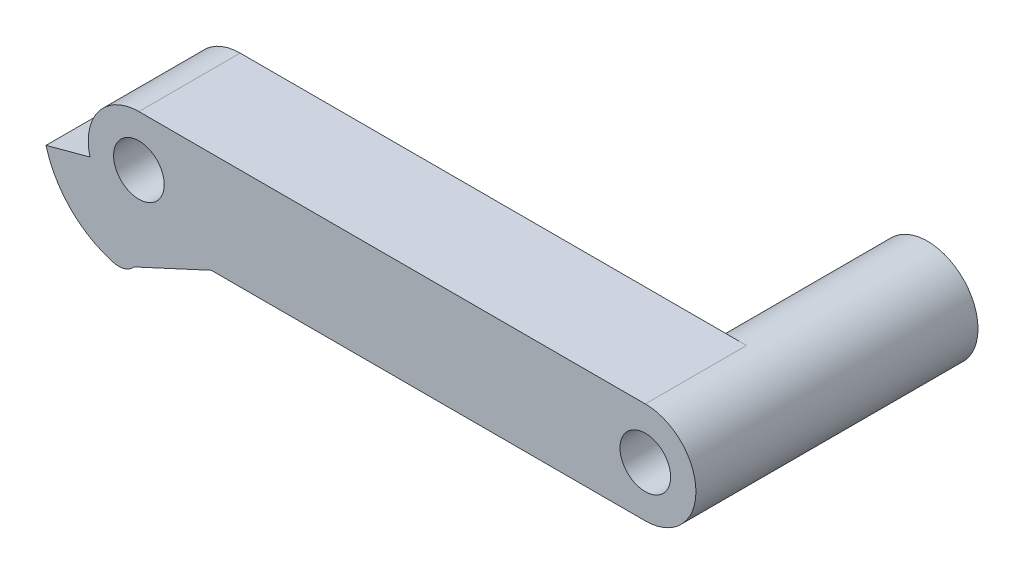
ISO-10303-21;
HEADER;
FILE_DESCRIPTION(('STEP AP214'),'2;1');
FILE_NAME('part.step','',(''),(''),'','','');
FILE_SCHEMA(('AUTOMOTIVE_DESIGN { 1 0 10303 214 1 1 1 1 }'));
ENDSEC;
DATA;
#1=APPLICATION_CONTEXT('core data for automotive mechanical design processes');
#2=APPLICATION_PROTOCOL_DEFINITION('international standard','automotive_design',2000,#1);
#3=PRODUCT_CONTEXT('',#1,'mechanical');
#4=PRODUCT('Part','Part','',(#3));
#5=PRODUCT_RELATED_PRODUCT_CATEGORY('part','',(#4));
#6=PRODUCT_DEFINITION_FORMATION('','',#4);
#7=PRODUCT_DEFINITION_CONTEXT('part definition',#1,'design');
#8=PRODUCT_DEFINITION('design','',#6,#7);
#9=PRODUCT_DEFINITION_SHAPE('','',#8);
#10=(LENGTH_UNIT() NAMED_UNIT(*) SI_UNIT(.MILLI.,.METRE.));
#11=(NAMED_UNIT(*) PLANE_ANGLE_UNIT() SI_UNIT($,.RADIAN.));
#12=(NAMED_UNIT(*) SI_UNIT($,.STERADIAN.) SOLID_ANGLE_UNIT());
#13=UNCERTAINTY_MEASURE_WITH_UNIT(LENGTH_MEASURE(1.E-05),#10,'distance_accuracy_value','');
#14=(GEOMETRIC_REPRESENTATION_CONTEXT(3) GLOBAL_UNCERTAINTY_ASSIGNED_CONTEXT((#13)) GLOBAL_UNIT_ASSIGNED_CONTEXT((#10,
#11,#12)) REPRESENTATION_CONTEXT('',''));
#15=CARTESIAN_POINT('',(0.,0.,0.));
#16=DIRECTION('',(0.,0.,1.));
#17=DIRECTION('',(1.,0.,0.));
#18=AXIS2_PLACEMENT_3D('',#15,#16,#17);
#19=CARTESIAN_POINT('',(0.,0.,-12.3012954674884));
#20=DIRECTION('',(0.,0.,1.));
#21=DIRECTION('',(1.,0.,0.));
#22=AXIS2_PLACEMENT_3D('',#19,#20,#21);
#23=CYLINDRICAL_SURFACE('',#22,9.5);
#24=CARTESIAN_POINT('',(0.,0.,10.));
#25=DIRECTION('',(0.,0.,1.));
#26=DIRECTION('',(1.,0.,0.));
#27=AXIS2_PLACEMENT_3D('',#24,#25,#26);
#28=CIRCLE('',#27,9.5);
#29=CARTESIAN_POINT('',(-9.17194693313327,-2.47495241485308,10.));
#30=VERTEX_POINT('',#29);
#31=CARTESIAN_POINT('',(-2.53333333333323,-9.1559937867073,10.));
#32=VERTEX_POINT('',#31);
#33=EDGE_CURVE('E117',#30,#32,#28,.T.);
#34=ORIENTED_EDGE('',*,*,#33,.F.);
#35=DIRECTION('',(0.,0.,1.));
#36=VECTOR('',#35,1.);
#37=CARTESIAN_POINT('',(-9.17194693313327,-2.47495241485308,-12.3012954674884));
#38=LINE('',#37,#36);
#39=CARTESIAN_POINT('',(-9.17194693313327,-2.47495241485308,0.));
#40=VERTEX_POINT('',#39);
#41=EDGE_CURVE('E102',#40,#30,#38,.T.);
#42=ORIENTED_EDGE('',*,*,#41,.F.);
#43=CARTESIAN_POINT('',(0.,0.,0.));
#44=DIRECTION('',(0.,0.,1.));
#45=DIRECTION('',(1.,0.,0.));
#46=AXIS2_PLACEMENT_3D('',#43,#44,#45);
#47=CIRCLE('',#46,9.5);
#48=CARTESIAN_POINT('',(-2.53333333333323,-9.1559937867073,0.));
#49=VERTEX_POINT('',#48);
#50=EDGE_CURVE('E112',#49,#40,#47,.F.);
#51=ORIENTED_EDGE('',*,*,#50,.F.);
#52=DIRECTION('',(0.,0.,1.));
#53=VECTOR('',#52,1.);
#54=CARTESIAN_POINT('',(-2.53333333333324,-9.1559937867073,-12.3012954674884));
#55=LINE('',#54,#53);
#56=EDGE_CURVE('E119',#49,#32,#55,.T.);
#57=ORIENTED_EDGE('',*,*,#56,.T.);
#58=EDGE_LOOP('',(#34,#42,#51,#57));
#59=FACE_BOUND('',#58,.T.);
#60=ADVANCED_FACE('F38',(#59),#23,.T.);
#61=CARTESIAN_POINT('',(0.,-5.,10.));
#62=DIRECTION('',(0.,1.,0.));
#63=DIRECTION('',(-1.,0.,0.));
#64=AXIS2_PLACEMENT_3D('',#61,#62,#63);
#65=PLANE('',#64);
#66=DIRECTION('',(1.,0.,0.));
#67=VECTOR('',#66,1.);
#68=CARTESIAN_POINT('',(0.,-5.,10.));
#69=LINE('',#68,#67);
#70=CARTESIAN_POINT('',(7.14343941971596,-5.,10.));
#71=VERTEX_POINT('',#70);
#72=CARTESIAN_POINT('',(50.,-5.,10.));
#73=VERTEX_POINT('',#72);
#74=EDGE_CURVE('E148',#71,#73,#69,.T.);
#75=ORIENTED_EDGE('',*,*,#74,.F.);
#76=DIRECTION('',(0.,0.,-1.));
#77=VECTOR('',#76,1.);
#78=CARTESIAN_POINT('',(7.14343941971596,-5.,10.));
#79=LINE('',#78,#77);
#80=CARTESIAN_POINT('',(7.14343941971596,-5.,0.));
#81=VERTEX_POINT('',#80);
#82=EDGE_CURVE('E178',#71,#81,#79,.T.);
#83=ORIENTED_EDGE('',*,*,#82,.T.);
#84=DIRECTION('',(1.,0.,0.));
#85=VECTOR('',#84,1.);
#86=CARTESIAN_POINT('',(0.,-5.,0.));
#87=LINE('',#86,#85);
#88=CARTESIAN_POINT('',(50.,-5.,0.));
#89=VERTEX_POINT('',#88);
#90=EDGE_CURVE('E145',#81,#89,#87,.T.);
#91=ORIENTED_EDGE('',*,*,#90,.T.);
#92=DIRECTION('',(0.,0.,-1.));
#93=VECTOR('',#92,1.);
#94=CARTESIAN_POINT('',(50.,-5.,10.));
#95=LINE('',#94,#93);
#96=EDGE_CURVE('E167',#73,#89,#95,.T.);
#97=ORIENTED_EDGE('',*,*,#96,.F.);
#98=EDGE_LOOP('',(#75,#83,#91,#97));
#99=FACE_BOUND('',#98,.T.);
#100=ADVANCED_FACE('F184',(#99),#65,.F.);
#101=CARTESIAN_POINT('',(50.,0.,10.));
#102=DIRECTION('',(0.,0.,-1.));
#103=DIRECTION('',(-1.,0.,0.));
#104=AXIS2_PLACEMENT_3D('',#101,#102,#103);
#105=CYLINDRICAL_SURFACE('',#104,5.);
#106=ORIENTED_EDGE('',*,*,#96,.T.);
#107=CARTESIAN_POINT('',(50.,0.,0.));
#108=DIRECTION('',(0.,0.,1.));
#109=DIRECTION('',(1.,0.,0.));
#110=AXIS2_PLACEMENT_3D('',#107,#108,#109);
#111=CIRCLE('',#110,5.);
#112=CARTESIAN_POINT('',(50.,5.,0.));
#113=VERTEX_POINT('',#112);
#114=EDGE_CURVE('E170',#113,#89,#111,.T.);
#115=ORIENTED_EDGE('',*,*,#114,.F.);
#116=DIRECTION('',(0.,0.,-1.));
#117=VECTOR('',#116,1.);
#118=CARTESIAN_POINT('',(50.,5.,10.));
#119=LINE('',#118,#117);
#120=CARTESIAN_POINT('',(50.,5.,10.));
#121=VERTEX_POINT('',#120);
#122=EDGE_CURVE('E164',#121,#113,#119,.T.);
#123=ORIENTED_EDGE('',*,*,#122,.F.);
#124=CARTESIAN_POINT('',(50.,0.,10.));
#125=DIRECTION('',(0.,0.,1.));
#126=DIRECTION('',(1.,0.,0.));
#127=AXIS2_PLACEMENT_3D('',#124,#125,#126);
#128=CIRCLE('',#127,5.);
#129=EDGE_CURVE('E150',#73,#121,#128,.T.);
#130=ORIENTED_EDGE('',*,*,#129,.F.);
#131=EDGE_LOOP('',(#106,#115,#123,#130));
#132=FACE_BOUND('',#131,.T.);
#133=CARTESIAN_POINT('',(50.,0.,-17.85));
#134=DIRECTION('',(0.,0.,1.));
#135=DIRECTION('',(1.,0.,0.));
#136=AXIS2_PLACEMENT_3D('',#133,#134,#135);
#137=CIRCLE('',#136,5.);
#138=CARTESIAN_POINT('',(55.,0.,-17.85));
#139=VERTEX_POINT('',#138);
#140=EDGE_CURVE('E138',#139,#139,#137,.T.);
#141=ORIENTED_EDGE('',*,*,#140,.T.);
#142=EDGE_LOOP('',(#141));
#143=FACE_BOUND('',#142,.T.);
#144=ADVANCED_FACE('F194',(#132,#143),#105,.T.);
#145=CARTESIAN_POINT('',(0.,5.,10.));
#146=DIRECTION('',(0.,1.,0.));
#147=DIRECTION('',(-1.,0.,0.));
#148=AXIS2_PLACEMENT_3D('',#145,#146,#147);
#149=PLANE('',#148);
#150=DIRECTION('',(1.,0.,0.));
#151=VECTOR('',#150,1.);
#152=CARTESIAN_POINT('',(0.,5.,0.));
#153=LINE('',#152,#151);
#154=CARTESIAN_POINT('',(0.,5.,0.));
#155=VERTEX_POINT('',#154);
#156=EDGE_CURVE('E159',#155,#113,#153,.T.);
#157=ORIENTED_EDGE('',*,*,#156,.F.);
#158=DIRECTION('',(0.,0.,-1.));
#159=VECTOR('',#158,1.);
#160=CARTESIAN_POINT('',(0.,5.,10.));
#161=LINE('',#160,#159);
#162=CARTESIAN_POINT('',(0.,5.,10.));
#163=VERTEX_POINT('',#162);
#164=EDGE_CURVE('E157',#163,#155,#161,.T.);
#165=ORIENTED_EDGE('',*,*,#164,.F.);
#166=DIRECTION('',(1.,0.,0.));
#167=VECTOR('',#166,1.);
#168=CARTESIAN_POINT('',(0.,5.,10.));
#169=LINE('',#168,#167);
#170=EDGE_CURVE('E153',#163,#121,#169,.T.);
#171=ORIENTED_EDGE('',*,*,#170,.T.);
#172=ORIENTED_EDGE('',*,*,#122,.T.);
#173=EDGE_LOOP('',(#157,#165,#171,#172));
#174=FACE_BOUND('',#173,.T.);
#175=ADVANCED_FACE('F233',(#174),#149,.T.);
#176=CARTESIAN_POINT('',(0.,0.,10.));
#177=DIRECTION('',(0.,0.,-1.));
#178=DIRECTION('',(-1.,0.,0.));
#179=AXIS2_PLACEMENT_3D('',#176,#177,#178);
#180=CYLINDRICAL_SURFACE('',#179,5.);
#181=DIRECTION('',(0.,0.,1.));
#182=VECTOR('',#181,1.);
#183=CARTESIAN_POINT('',(-4.82734049112278,-1.3026065341332,-12.3012954674884));
#184=LINE('',#183,#182);
#185=CARTESIAN_POINT('',(-4.82734049112278,-1.3026065341332,0.));
#186=VERTEX_POINT('',#185);
#187=CARTESIAN_POINT('',(-4.82734049112278,-1.3026065341332,10.));
#188=VERTEX_POINT('',#187);
#189=EDGE_CURVE('E113',#186,#188,#184,.T.);
#190=ORIENTED_EDGE('',*,*,#189,.T.);
#191=CARTESIAN_POINT('',(0.,0.,10.));
#192=DIRECTION('',(0.,0.,1.));
#193=DIRECTION('',(1.,0.,0.));
#194=AXIS2_PLACEMENT_3D('',#191,#192,#193);
#195=CIRCLE('',#194,5.);
#196=EDGE_CURVE('E127',#163,#188,#195,.T.);
#197=ORIENTED_EDGE('',*,*,#196,.F.);
#198=ORIENTED_EDGE('',*,*,#164,.T.);
#199=CARTESIAN_POINT('',(0.,0.,0.));
#200=DIRECTION('',(0.,0.,1.));
#201=DIRECTION('',(1.,0.,0.));
#202=AXIS2_PLACEMENT_3D('',#199,#200,#201);
#203=CIRCLE('',#202,5.);
#204=EDGE_CURVE('E151',#155,#186,#203,.T.);
#205=ORIENTED_EDGE('',*,*,#204,.T.);
#206=EDGE_LOOP('',(#190,#197,#198,#205));
#207=FACE_BOUND('',#206,.T.);
#208=ADVANCED_FACE('F226',(#207),#180,.T.);
#209=CARTESIAN_POINT('',(0.,0.,10.));
#210=DIRECTION('',(0.,0.,1.));
#211=DIRECTION('',(1.,0.,0.));
#212=AXIS2_PLACEMENT_3D('',#209,#210,#211);
#213=PLANE('',#212);
#214=CARTESIAN_POINT('',(50.,0.,10.));
#215=DIRECTION('',(0.,0.,-1.));
#216=DIRECTION('',(-1.,0.,0.));
#217=AXIS2_PLACEMENT_3D('',#214,#215,#216);
#218=CIRCLE('',#217,2.5);
#219=CARTESIAN_POINT('',(47.5,0.,10.));
#220=VERTEX_POINT('',#219);
#221=EDGE_CURVE('E404',#220,#220,#218,.T.);
#222=ORIENTED_EDGE('',*,*,#221,.T.);
#223=EDGE_LOOP('',(#222));
#224=FACE_BOUND('',#223,.T.);
#225=ORIENTED_EDGE('',*,*,#33,.T.);
#226=CARTESIAN_POINT('',(-1.99999999999992,-7.2284161474005,10.));
#227=DIRECTION('',(0.,0.,1.));
#228=DIRECTION('',(1.,0.,0.));
#229=AXIS2_PLACEMENT_3D('',#226,#227,#228);
#230=CIRCLE('',#229,2.);
#231=CARTESIAN_POINT('',(-0.476093430047268,-8.52368012283375,10.));
#232=VERTEX_POINT('',#231);
#233=EDGE_CURVE('E174',#32,#232,#230,.T.);
#234=ORIENTED_EDGE('',*,*,#233,.T.);
#235=DIRECTION('',(-0.907643098281649,-0.419742785693439,0.));
#236=VECTOR('',#235,1.);
#237=CARTESIAN_POINT('',(7.14343941971596,-5.,10.));
#238=LINE('',#237,#236);
#239=EDGE_CURVE('E12',#232,#71,#238,.F.);
#240=ORIENTED_EDGE('',*,*,#239,.T.);
#241=ORIENTED_EDGE('',*,*,#74,.T.);
#242=ORIENTED_EDGE('',*,*,#129,.T.);
#243=ORIENTED_EDGE('',*,*,#170,.F.);
#244=ORIENTED_EDGE('',*,*,#196,.T.);
#245=DIRECTION('',(-0.965468098224555,-0.260521306826641,0.));
#246=VECTOR('',#245,1.);
#247=CARTESIAN_POINT('',(-9.17194693313327,-2.47495241485309,10.));
#248=LINE('',#247,#246);
#249=EDGE_CURVE('E107',#188,#30,#248,.T.);
#250=ORIENTED_EDGE('',*,*,#249,.T.);
#251=EDGE_LOOP('',(#225,#234,#240,#241,#242,#243,#244,#250));
#252=FACE_BOUND('',#251,.T.);
#253=CARTESIAN_POINT('',(0.,0.,10.));
#254=DIRECTION('',(0.,0.,1.));
#255=DIRECTION('',(1.,0.,0.));
#256=AXIS2_PLACEMENT_3D('',#253,#254,#255);
#257=CIRCLE('',#256,2.5);
#258=CARTESIAN_POINT('',(2.5,0.,10.));
#259=VERTEX_POINT('',#258);
#260=EDGE_CURVE('E141',#259,#259,#257,.T.);
#261=ORIENTED_EDGE('',*,*,#260,.F.);
#262=EDGE_LOOP('',(#261));
#263=FACE_BOUND('',#262,.T.);
#264=ADVANCED_FACE('F123',(#224,#252,#263),#213,.T.);
#265=CARTESIAN_POINT('',(0.,0.,0.));
#266=DIRECTION('',(0.,0.,1.));
#267=DIRECTION('',(1.,0.,0.));
#268=AXIS2_PLACEMENT_3D('',#265,#266,#267);
#269=PLANE('',#268);
#270=CARTESIAN_POINT('',(0.,0.,0.));
#271=DIRECTION('',(0.,0.,1.));
#272=DIRECTION('',(1.,0.,0.));
#273=AXIS2_PLACEMENT_3D('',#270,#271,#272);
#274=CIRCLE('',#273,2.5);
#275=CARTESIAN_POINT('',(2.5,0.,0.));
#276=VERTEX_POINT('',#275);
#277=EDGE_CURVE('E142',#276,#276,#274,.T.);
#278=ORIENTED_EDGE('',*,*,#277,.T.);
#279=EDGE_LOOP('',(#278));
#280=FACE_BOUND('',#279,.T.);
#281=ORIENTED_EDGE('',*,*,#90,.F.);
#282=DIRECTION('',(0.907643098281649,0.419742785693439,0.));
#283=VECTOR('',#282,1.);
#284=CARTESIAN_POINT('',(3.16344298703683,-6.84056353523254,0.));
#285=LINE('',#284,#283);
#286=CARTESIAN_POINT('',(-0.476093430047268,-8.52368012283375,0.));
#287=VERTEX_POINT('',#286);
#288=EDGE_CURVE('E46',#81,#287,#285,.F.);
#289=ORIENTED_EDGE('',*,*,#288,.T.);
#290=CARTESIAN_POINT('',(-1.99999999999992,-7.2284161474005,0.));
#291=DIRECTION('',(0.,0.,1.));
#292=DIRECTION('',(1.,0.,0.));
#293=AXIS2_PLACEMENT_3D('',#290,#291,#292);
#294=CIRCLE('',#293,2.);
#295=EDGE_CURVE('E176',#287,#49,#294,.F.);
#296=ORIENTED_EDGE('',*,*,#295,.T.);
#297=ORIENTED_EDGE('',*,*,#50,.T.);
#298=DIRECTION('',(0.965468098224555,0.260521306826641,0.));
#299=VECTOR('',#298,1.);
#300=CARTESIAN_POINT('',(-9.17194693313327,-2.47495241485309,0.));
#301=LINE('',#300,#299);
#302=EDGE_CURVE('E109',#40,#186,#301,.T.);
#303=ORIENTED_EDGE('',*,*,#302,.T.);
#304=ORIENTED_EDGE('',*,*,#204,.F.);
#305=ORIENTED_EDGE('',*,*,#156,.T.);
#306=ORIENTED_EDGE('',*,*,#114,.T.);
#307=EDGE_LOOP('',(#281,#289,#296,#297,#303,#304,#305,#306));
#308=FACE_BOUND('',#307,.T.);
#309=ADVANCED_FACE('F188',(#280,#308),#269,.F.);
#310=CARTESIAN_POINT('',(0.,0.,0.));
#311=DIRECTION('',(0.,0.,1.));
#312=DIRECTION('',(1.,0.,0.));
#313=AXIS2_PLACEMENT_3D('',#310,#311,#312);
#314=CYLINDRICAL_SURFACE('',#313,2.5);
#315=ORIENTED_EDGE('',*,*,#277,.F.);
#316=EDGE_LOOP('',(#315));
#317=FACE_BOUND('',#316,.T.);
#318=ORIENTED_EDGE('',*,*,#260,.T.);
#319=EDGE_LOOP('',(#318));
#320=FACE_BOUND('',#319,.T.);
#321=ADVANCED_FACE('F219',(#317,#320),#314,.F.);
#322=CARTESIAN_POINT('',(50.,0.,-17.85));
#323=DIRECTION('',(0.,0.,1.));
#324=DIRECTION('',(1.,0.,0.));
#325=AXIS2_PLACEMENT_3D('',#322,#323,#324);
#326=PLANE('',#325);
#327=CARTESIAN_POINT('',(50.,0.,-17.85));
#328=DIRECTION('',(0.,0.,-1.));
#329=DIRECTION('',(-1.,0.,0.));
#330=AXIS2_PLACEMENT_3D('',#327,#328,#329);
#331=CIRCLE('',#330,2.5);
#332=CARTESIAN_POINT('',(47.5,0.,-17.85));
#333=VERTEX_POINT('',#332);
#334=EDGE_CURVE('E131',#333,#333,#331,.T.);
#335=ORIENTED_EDGE('',*,*,#334,.F.);
#336=EDGE_LOOP('',(#335));
#337=FACE_BOUND('',#336,.T.);
#338=ORIENTED_EDGE('',*,*,#140,.F.);
#339=EDGE_LOOP('',(#338));
#340=FACE_BOUND('',#339,.T.);
#341=ADVANCED_FACE('F216',(#337,#340),#326,.F.);
#342=CARTESIAN_POINT('',(-9.17194693313327,-2.47495241485309,-12.3012954674884));
#343=DIRECTION('',(-0.260521306826641,0.965468098224555,0.));
#344=DIRECTION('',(-0.965468098224555,-0.260521306826641,0.));
#345=AXIS2_PLACEMENT_3D('',#342,#343,#344);
#346=PLANE('',#345);
#347=ORIENTED_EDGE('',*,*,#41,.T.);
#348=ORIENTED_EDGE('',*,*,#249,.F.);
#349=ORIENTED_EDGE('',*,*,#189,.F.);
#350=ORIENTED_EDGE('',*,*,#302,.F.);
#351=EDGE_LOOP('',(#347,#348,#349,#350));
#352=FACE_BOUND('',#351,.T.);
#353=ADVANCED_FACE('F104',(#352),#346,.T.);
#354=CARTESIAN_POINT('',(-1.99999999999992,-7.2284161474005,-12.3012954674884));
#355=DIRECTION('',(0.,0.,1.));
#356=DIRECTION('',(1.,0.,0.));
#357=AXIS2_PLACEMENT_3D('',#354,#355,#356);
#358=CYLINDRICAL_SURFACE('',#357,2.);
#359=ORIENTED_EDGE('',*,*,#295,.F.);
#360=DIRECTION('',(0.,0.,1.));
#361=VECTOR('',#360,1.);
#362=CARTESIAN_POINT('',(-0.476093430047268,-8.52368012283375,-12.3012954674884));
#363=LINE('',#362,#361);
#364=EDGE_CURVE('E53',#287,#232,#363,.T.);
#365=ORIENTED_EDGE('',*,*,#364,.T.);
#366=ORIENTED_EDGE('',*,*,#233,.F.);
#367=ORIENTED_EDGE('',*,*,#56,.F.);
#368=EDGE_LOOP('',(#359,#365,#366,#367));
#369=FACE_BOUND('',#368,.T.);
#370=ADVANCED_FACE('F198',(#369),#358,.T.);
#371=CARTESIAN_POINT('',(7.14343941971596,-5.,-12.3012954674884));
#372=DIRECTION('',(0.419742785693439,-0.907643098281649,0.));
#373=DIRECTION('',(0.,0.,1.));
#374=AXIS2_PLACEMENT_3D('',#371,#372,#373);
#375=PLANE('',#374);
#376=ORIENTED_EDGE('',*,*,#239,.F.);
#377=ORIENTED_EDGE('',*,*,#364,.F.);
#378=ORIENTED_EDGE('',*,*,#288,.F.);
#379=ORIENTED_EDGE('',*,*,#82,.F.);
#380=EDGE_LOOP('',(#376,#377,#378,#379));
#381=FACE_BOUND('',#380,.T.);
#382=ADVANCED_FACE('F40',(#381),#375,.T.);
#383=CARTESIAN_POINT('',(50.,0.,-9.85));
#384=DIRECTION('',(0.,0.,-1.));
#385=DIRECTION('',(-1.,0.,0.));
#386=AXIS2_PLACEMENT_3D('',#383,#384,#385);
#387=CYLINDRICAL_SURFACE('',#386,2.5);
#388=CARTESIAN_POINT('',(50.,0.,-9.85));
#389=DIRECTION('',(0.,0.,-1.));
#390=DIRECTION('',(-1.,0.,0.));
#391=AXIS2_PLACEMENT_3D('',#388,#389,#390);
#392=CIRCLE('',#391,2.5);
#393=CARTESIAN_POINT('',(47.5,0.,-9.85));
#394=VERTEX_POINT('',#393);
#395=EDGE_CURVE('E128',#394,#394,#392,.T.);
#396=ORIENTED_EDGE('',*,*,#395,.F.);
#397=EDGE_LOOP('',(#396));
#398=FACE_BOUND('',#397,.T.);
#399=ORIENTED_EDGE('',*,*,#334,.T.);
#400=EDGE_LOOP('',(#399));
#401=FACE_BOUND('',#400,.T.);
#402=ADVANCED_FACE('F197',(#398,#401),#387,.F.);
#403=CARTESIAN_POINT('',(50.,0.,-9.85));
#404=DIRECTION('',(0.,0.,-1.));
#405=DIRECTION('',(-1.,0.,0.));
#406=AXIS2_PLACEMENT_3D('',#403,#404,#405);
#407=PLANE('',#406);
#408=CARTESIAN_POINT('',(50.,0.,-9.85));
#409=DIRECTION('',(0.,0.,-1.));
#410=DIRECTION('',(-1.,0.,0.));
#411=AXIS2_PLACEMENT_3D('',#408,#409,#410);
#412=CIRCLE('',#411,1.75);
#413=CARTESIAN_POINT('',(48.25,0.,-9.85));
#414=VERTEX_POINT('',#413);
#415=EDGE_CURVE('E409',#414,#414,#412,.T.);
#416=ORIENTED_EDGE('',*,*,#415,.F.);
#417=EDGE_LOOP('',(#416));
#418=FACE_BOUND('',#417,.T.);
#419=ORIENTED_EDGE('',*,*,#395,.T.);
#420=EDGE_LOOP('',(#419));
#421=FACE_BOUND('',#420,.T.);
#422=ADVANCED_FACE('F203',(#418,#421),#407,.T.);
#423=CARTESIAN_POINT('',(50.,0.,14.9497474683058));
#424=DIRECTION('',(0.,0.,-1.));
#425=DIRECTION('',(-1.,0.,0.));
#426=AXIS2_PLACEMENT_3D('',#423,#424,#425);
#427=CYLINDRICAL_SURFACE('',#426,1.75);
#428=ORIENTED_EDGE('',*,*,#415,.T.);
#429=EDGE_LOOP('',(#428));
#430=FACE_BOUND('',#429,.T.);
#431=CARTESIAN_POINT('',(50.,0.,1.));
#432=DIRECTION('',(0.,0.,1.));
#433=DIRECTION('',(1.,0.,0.));
#434=AXIS2_PLACEMENT_3D('',#431,#432,#433);
#435=CIRCLE('',#434,1.75);
#436=CARTESIAN_POINT('',(51.75,0.,1.));
#437=VERTEX_POINT('',#436);
#438=EDGE_CURVE('E399',#437,#437,#435,.F.);
#439=ORIENTED_EDGE('',*,*,#438,.F.);
#440=EDGE_LOOP('',(#439));
#441=FACE_BOUND('',#440,.T.);
#442=ADVANCED_FACE('F297',(#430,#441),#427,.F.);
#443=CARTESIAN_POINT('',(50.,0.,10.));
#444=DIRECTION('',(0.,0.,-1.));
#445=DIRECTION('',(-1.,0.,0.));
#446=AXIS2_PLACEMENT_3D('',#443,#444,#445);
#447=CYLINDRICAL_SURFACE('',#446,2.5);
#448=ORIENTED_EDGE('',*,*,#221,.F.);
#449=EDGE_LOOP('',(#448));
#450=FACE_BOUND('',#449,.T.);
#451=CARTESIAN_POINT('',(50.,0.,1.));
#452=DIRECTION('',(0.,0.,-1.));
#453=DIRECTION('',(-1.,0.,0.));
#454=AXIS2_PLACEMENT_3D('',#451,#452,#453);
#455=CIRCLE('',#454,2.5);
#456=CARTESIAN_POINT('',(47.5,0.,1.));
#457=VERTEX_POINT('',#456);
#458=EDGE_CURVE('E402',#457,#457,#455,.T.);
#459=ORIENTED_EDGE('',*,*,#458,.T.);
#460=EDGE_LOOP('',(#459));
#461=FACE_BOUND('',#460,.T.);
#462=ADVANCED_FACE('F304',(#450,#461),#447,.F.);
#463=CARTESIAN_POINT('',(50.,0.,1.));
#464=DIRECTION('',(0.,0.,-1.));
#465=DIRECTION('',(-1.,0.,0.));
#466=AXIS2_PLACEMENT_3D('',#463,#464,#465);
#467=PLANE('',#466);
#468=ORIENTED_EDGE('',*,*,#438,.T.);
#469=EDGE_LOOP('',(#468));
#470=FACE_BOUND('',#469,.T.);
#471=ORIENTED_EDGE('',*,*,#458,.F.);
#472=EDGE_LOOP('',(#471));
#473=FACE_BOUND('',#472,.T.);
#474=ADVANCED_FACE('F312',(#470,#473),#467,.F.);
#475=CLOSED_SHELL('',(#60,#100,#144,#175,#208,#264,#309,#321,#341,#353,#370,#382,#402,#422,#442,
#462,#474));
#476=MANIFOLD_SOLID_BREP('B2',#475);
#477=ADVANCED_BREP_SHAPE_REPRESENTATION('',(#18,#476),#14);
#478=SHAPE_DEFINITION_REPRESENTATION(#9,#477);
ENDSEC;
END-ISO-10303-21;
